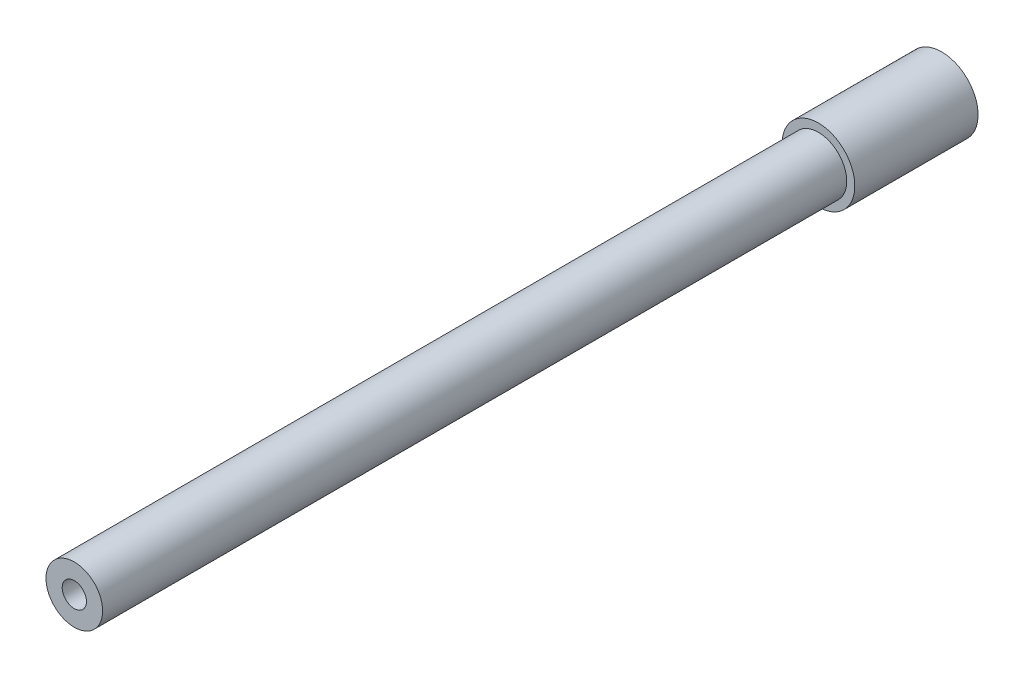
ISO-10303-21;
HEADER;
FILE_DESCRIPTION(('STEP AP214'),'2;1');
FILE_NAME('part.step','',(''),(''),'','','');
FILE_SCHEMA(('AUTOMOTIVE_DESIGN { 1 0 10303 214 1 1 1 1 }'));
ENDSEC;
DATA;
#1=APPLICATION_CONTEXT('core data for automotive mechanical design processes');
#2=APPLICATION_PROTOCOL_DEFINITION('international standard','automotive_design',2000,#1);
#3=PRODUCT_CONTEXT('',#1,'mechanical');
#4=PRODUCT('Part','Part','',(#3));
#5=PRODUCT_RELATED_PRODUCT_CATEGORY('part','',(#4));
#6=PRODUCT_DEFINITION_FORMATION('','',#4);
#7=PRODUCT_DEFINITION_CONTEXT('part definition',#1,'design');
#8=PRODUCT_DEFINITION('design','',#6,#7);
#9=PRODUCT_DEFINITION_SHAPE('','',#8);
#10=(LENGTH_UNIT() NAMED_UNIT(*) SI_UNIT(.MILLI.,.METRE.));
#11=(NAMED_UNIT(*) PLANE_ANGLE_UNIT() SI_UNIT($,.RADIAN.));
#12=(NAMED_UNIT(*) SI_UNIT($,.STERADIAN.) SOLID_ANGLE_UNIT());
#13=UNCERTAINTY_MEASURE_WITH_UNIT(LENGTH_MEASURE(1.E-05),#10,'distance_accuracy_value','');
#14=(GEOMETRIC_REPRESENTATION_CONTEXT(3) GLOBAL_UNCERTAINTY_ASSIGNED_CONTEXT((#13)) GLOBAL_UNIT_ASSIGNED_CONTEXT((#10,
#11,#12)) REPRESENTATION_CONTEXT('',''));
#15=CARTESIAN_POINT('',(0.,0.,0.));
#16=DIRECTION('',(0.,0.,1.));
#17=DIRECTION('',(1.,0.,0.));
#18=AXIS2_PLACEMENT_3D('',#15,#16,#17);
#19=CARTESIAN_POINT('',(5.82639397322076,0.,53.62));
#20=DIRECTION('',(0.,0.,-1.));
#21=DIRECTION('',(-1.,0.,0.));
#22=AXIS2_PLACEMENT_3D('',#19,#20,#21);
#23=CYLINDRICAL_SURFACE('',#22,1.75);
#24=CARTESIAN_POINT('',(5.82639397322076,0.,53.62));
#25=DIRECTION('',(0.,0.,1.));
#26=DIRECTION('',(1.,0.,0.));
#27=AXIS2_PLACEMENT_3D('',#24,#25,#26);
#28=CIRCLE('',#27,1.75);
#29=CARTESIAN_POINT('',(7.57639397322076,0.,53.62));
#30=VERTEX_POINT('',#29);
#31=EDGE_CURVE('E37',#30,#30,#28,.T.);
#32=ORIENTED_EDGE('',*,*,#31,.F.);
#33=EDGE_LOOP('',(#32));
#34=FACE_BOUND('',#33,.T.);
#35=CARTESIAN_POINT('',(5.82639397322076,0.,7.62));
#36=DIRECTION('',(0.,0.,-1.));
#37=DIRECTION('',(-1.,0.,0.));
#38=AXIS2_PLACEMENT_3D('',#35,#36,#37);
#39=CIRCLE('',#38,1.75);
#40=CARTESIAN_POINT('',(4.07639397322076,0.,7.62));
#41=VERTEX_POINT('',#40);
#42=EDGE_CURVE('E10',#41,#41,#39,.T.);
#43=ORIENTED_EDGE('',*,*,#42,.F.);
#44=EDGE_LOOP('',(#43));
#45=FACE_BOUND('',#44,.T.);
#46=ADVANCED_FACE('F31',(#34,#45),#23,.T.);
#47=CARTESIAN_POINT('',(5.82639397322076,0.,53.62));
#48=DIRECTION('',(0.,0.,1.));
#49=DIRECTION('',(1.,0.,0.));
#50=AXIS2_PLACEMENT_3D('',#47,#48,#49);
#51=PLANE('',#50);
#52=CARTESIAN_POINT('',(5.82639397322076,0.,53.62));
#53=DIRECTION('',(0.,0.,1.));
#54=DIRECTION('',(1.,0.,0.));
#55=AXIS2_PLACEMENT_3D('',#52,#53,#54);
#56=CIRCLE('',#55,0.749999999999998);
#57=CARTESIAN_POINT('',(6.57639397322076,0.,53.62));
#58=VERTEX_POINT('',#57);
#59=EDGE_CURVE('E45',#58,#58,#56,.T.);
#60=ORIENTED_EDGE('',*,*,#59,.F.);
#61=EDGE_LOOP('',(#60));
#62=FACE_BOUND('',#61,.T.);
#63=ORIENTED_EDGE('',*,*,#31,.T.);
#64=EDGE_LOOP('',(#63));
#65=FACE_BOUND('',#64,.T.);
#66=ADVANCED_FACE('F74',(#62,#65),#51,.T.);
#67=CARTESIAN_POINT('',(5.82639397322076,0.,43.62));
#68=DIRECTION('',(0.,0.,1.));
#69=DIRECTION('',(1.,0.,0.));
#70=AXIS2_PLACEMENT_3D('',#67,#68,#69);
#71=CYLINDRICAL_SURFACE('',#70,0.749999999999998);
#72=CARTESIAN_POINT('',(5.82639397322076,0.,43.62));
#73=DIRECTION('',(0.,0.,1.));
#74=DIRECTION('',(1.,0.,0.));
#75=AXIS2_PLACEMENT_3D('',#72,#73,#74);
#76=CIRCLE('',#75,0.749999999999998);
#77=CARTESIAN_POINT('',(6.57639397322076,0.,43.62));
#78=VERTEX_POINT('',#77);
#79=EDGE_CURVE('E41',#78,#78,#76,.T.);
#80=ORIENTED_EDGE('',*,*,#79,.F.);
#81=EDGE_LOOP('',(#80));
#82=FACE_BOUND('',#81,.T.);
#83=ORIENTED_EDGE('',*,*,#59,.T.);
#84=EDGE_LOOP('',(#83));
#85=FACE_BOUND('',#84,.T.);
#86=ADVANCED_FACE('F70',(#82,#85),#71,.F.);
#87=CARTESIAN_POINT('',(5.82639397322076,0.,43.62));
#88=DIRECTION('',(0.,0.,1.));
#89=DIRECTION('',(1.,0.,0.));
#90=AXIS2_PLACEMENT_3D('',#87,#88,#89);
#91=PLANE('',#90);
#92=ORIENTED_EDGE('',*,*,#79,.T.);
#93=EDGE_LOOP('',(#92));
#94=FACE_BOUND('',#93,.T.);
#95=ADVANCED_FACE('F62',(#94),#91,.T.);
#96=CARTESIAN_POINT('',(5.82639397322076,0.,7.62));
#97=DIRECTION('',(0.,0.,-1.));
#98=DIRECTION('',(-1.,0.,0.));
#99=AXIS2_PLACEMENT_3D('',#96,#97,#98);
#100=PLANE('',#99);
#101=CARTESIAN_POINT('',(5.82639397322076,0.,7.62));
#102=DIRECTION('',(0.,0.,-1.));
#103=DIRECTION('',(-1.,0.,0.));
#104=AXIS2_PLACEMENT_3D('',#101,#102,#103);
#105=CIRCLE('',#104,2.25);
#106=CARTESIAN_POINT('',(3.57639397322076,0.,7.62));
#107=VERTEX_POINT('',#106);
#108=EDGE_CURVE('E49',#107,#107,#105,.T.);
#109=ORIENTED_EDGE('',*,*,#108,.F.);
#110=EDGE_LOOP('',(#109));
#111=FACE_BOUND('',#110,.T.);
#112=ORIENTED_EDGE('',*,*,#42,.T.);
#113=EDGE_LOOP('',(#112));
#114=FACE_BOUND('',#113,.T.);
#115=ADVANCED_FACE('F60',(#111,#114),#100,.F.);
#116=CARTESIAN_POINT('',(5.82639397322076,0.,7.62));
#117=DIRECTION('',(0.,0.,-1.));
#118=DIRECTION('',(-1.,0.,0.));
#119=AXIS2_PLACEMENT_3D('',#116,#117,#118);
#120=CYLINDRICAL_SURFACE('',#119,2.25);
#121=CARTESIAN_POINT('',(5.82639397322076,0.,0.));
#122=DIRECTION('',(0.,0.,-1.));
#123=DIRECTION('',(-1.,0.,0.));
#124=AXIS2_PLACEMENT_3D('',#121,#122,#123);
#125=CIRCLE('',#124,2.25);
#126=CARTESIAN_POINT('',(3.57639397322076,0.,0.));
#127=VERTEX_POINT('',#126);
#128=EDGE_CURVE('E51',#127,#127,#125,.T.);
#129=CARTESIAN_POINT('',(3.57639397322076,0.,7.62));
#130=CARTESIAN_POINT('',(3.57639397322076,0.,7.540625));
#131=CARTESIAN_POINT('',(3.57639397322076,0.,7.46125));
#132=CARTESIAN_POINT('',(3.57639397322076,0.,7.3025));
#133=CARTESIAN_POINT('',(3.57639397322076,0.,7.223125));
#134=CARTESIAN_POINT('',(3.57639397322076,0.,7.064375));
#135=CARTESIAN_POINT('',(3.57639397322076,0.,6.985));
#136=CARTESIAN_POINT('',(3.57639397322076,0.,6.82625));
#137=CARTESIAN_POINT('',(3.57639397322076,0.,6.746875));
#138=CARTESIAN_POINT('',(3.57639397322076,0.,6.588125));
#139=CARTESIAN_POINT('',(3.57639397322076,0.,6.50875));
#140=CARTESIAN_POINT('',(3.57639397322076,0.,6.35));
#141=CARTESIAN_POINT('',(3.57639397322076,0.,6.270625));
#142=CARTESIAN_POINT('',(3.57639397322076,0.,6.111875));
#143=CARTESIAN_POINT('',(3.57639397322076,0.,6.0325));
#144=CARTESIAN_POINT('',(3.57639397322076,0.,5.87375));
#145=CARTESIAN_POINT('',(3.57639397322076,0.,5.794375));
#146=CARTESIAN_POINT('',(3.57639397322076,0.,5.635625));
#147=CARTESIAN_POINT('',(3.57639397322076,0.,5.55625));
#148=CARTESIAN_POINT('',(3.57639397322076,0.,5.3975));
#149=CARTESIAN_POINT('',(3.57639397322076,0.,5.318125));
#150=CARTESIAN_POINT('',(3.57639397322076,0.,5.159375));
#151=CARTESIAN_POINT('',(3.57639397322076,0.,5.08));
#152=CARTESIAN_POINT('',(3.57639397322076,0.,4.92125));
#153=CARTESIAN_POINT('',(3.57639397322076,0.,4.841875));
#154=CARTESIAN_POINT('',(3.57639397322076,0.,4.683125));
#155=CARTESIAN_POINT('',(3.57639397322076,0.,4.60375));
#156=CARTESIAN_POINT('',(3.57639397322076,0.,4.445));
#157=CARTESIAN_POINT('',(3.57639397322076,0.,4.365625));
#158=CARTESIAN_POINT('',(3.57639397322076,0.,4.206875));
#159=CARTESIAN_POINT('',(3.57639397322076,0.,4.1275));
#160=CARTESIAN_POINT('',(3.57639397322076,0.,3.96875));
#161=CARTESIAN_POINT('',(3.57639397322076,0.,3.889375));
#162=CARTESIAN_POINT('',(3.57639397322076,0.,3.730625));
#163=CARTESIAN_POINT('',(3.57639397322076,0.,3.65125));
#164=CARTESIAN_POINT('',(3.57639397322076,0.,3.4925));
#165=CARTESIAN_POINT('',(3.57639397322076,0.,3.413125));
#166=CARTESIAN_POINT('',(3.57639397322076,0.,3.254375));
#167=CARTESIAN_POINT('',(3.57639397322076,0.,3.175));
#168=CARTESIAN_POINT('',(3.57639397322076,0.,3.01625));
#169=CARTESIAN_POINT('',(3.57639397322076,0.,2.936875));
#170=CARTESIAN_POINT('',(3.57639397322076,0.,2.778125));
#171=CARTESIAN_POINT('',(3.57639397322076,0.,2.69875));
#172=CARTESIAN_POINT('',(3.57639397322076,0.,2.54));
#173=CARTESIAN_POINT('',(3.57639397322076,0.,2.460625));
#174=CARTESIAN_POINT('',(3.57639397322076,0.,2.301875));
#175=CARTESIAN_POINT('',(3.57639397322076,0.,2.2225));
#176=CARTESIAN_POINT('',(3.57639397322076,0.,2.06375));
#177=CARTESIAN_POINT('',(3.57639397322076,0.,1.984375));
#178=CARTESIAN_POINT('',(3.57639397322076,0.,1.825625));
#179=CARTESIAN_POINT('',(3.57639397322076,0.,1.74625));
#180=CARTESIAN_POINT('',(3.57639397322076,0.,1.5875));
#181=CARTESIAN_POINT('',(3.57639397322076,0.,1.508125));
#182=CARTESIAN_POINT('',(3.57639397322076,0.,1.349375));
#183=CARTESIAN_POINT('',(3.57639397322076,0.,1.27));
#184=CARTESIAN_POINT('',(3.57639397322076,0.,1.11125));
#185=CARTESIAN_POINT('',(3.57639397322076,0.,1.031875));
#186=CARTESIAN_POINT('',(3.57639397322076,0.,0.873125));
#187=CARTESIAN_POINT('',(3.57639397322076,0.,0.79375));
#188=CARTESIAN_POINT('',(3.57639397322076,0.,0.635));
#189=CARTESIAN_POINT('',(3.57639397322076,0.,0.555625));
#190=CARTESIAN_POINT('',(3.57639397322076,0.,0.396875));
#191=CARTESIAN_POINT('',(3.57639397322076,0.,0.3175));
#192=CARTESIAN_POINT('',(3.57639397322076,0.,0.15875));
#193=CARTESIAN_POINT('',(3.57639397322076,0.,0.0793749999999999));
#194=CARTESIAN_POINT('',(3.57639397322076,0.,0.));
#195=B_SPLINE_CURVE_WITH_KNOTS('',3,(#129,#130,#131,#132,#133,#134,#135,#136,#137,#138,#139,
#140,#141,#142,#143,#144,#145,#146,#147,#148,#149,#150,#151,#152,#153,#154,#155,#156,#157,#158,
#159,#160,#161,#162,#163,#164,#165,#166,#167,#168,#169,#170,#171,#172,#173,#174,#175,#176,#177,
#178,#179,#180,#181,#182,#183,#184,#185,#186,#187,#188,#189,#190,#191,#192,#193,#194),
.UNSPECIFIED.,.F.,.F.,(4,2,2,2,2,2,2,2,2,2,2,2,2,2,2,2,2,2,2,2,2,2,2,2,2,2,2,2,2,2,2,2,4),(0.,
0.238125,0.47625,0.714375000000001,0.9525,1.190625,1.42875,1.666875,1.905,2.143125,2.38125,
2.619375,2.8575,3.095625,3.33375,3.571875,3.81,4.048125,4.28625,4.524375,4.7625,5.000625,
5.23875,5.476875,5.715,5.953125,6.19125,6.429375,6.6675,6.905625,7.14375,7.381875,7.62),.UNSPECIFIED.);
#196=EDGE_CURVE('BSEAM57',#107,#127,#195,.T.);
#197=ORIENTED_EDGE('',*,*,#108,.T.);
#198=ORIENTED_EDGE('',*,*,#128,.F.);
#199=ORIENTED_EDGE('',*,*,#196,.T.);
#200=ORIENTED_EDGE('',*,*,#196,.F.);
#201=EDGE_LOOP('',(#197,#199,#198,#200));
#202=FACE_BOUND('',#201,.T.);
#203=ADVANCED_FACE('F57',(#202),#120,.T.);
#204=CARTESIAN_POINT('',(5.82639397322076,0.,0.));
#205=DIRECTION('',(0.,0.,1.));
#206=DIRECTION('',(1.,0.,0.));
#207=AXIS2_PLACEMENT_3D('',#204,#205,#206);
#208=PLANE('',#207);
#209=ORIENTED_EDGE('',*,*,#128,.T.);
#210=EDGE_LOOP('',(#209));
#211=FACE_BOUND('',#210,.T.);
#212=ADVANCED_FACE('F68',(#211),#208,.F.);
#213=CLOSED_SHELL('',(#46,#66,#86,#95,#115,#203,#212));
#214=MANIFOLD_SOLID_BREP('B2',#213);
#215=ADVANCED_BREP_SHAPE_REPRESENTATION('',(#18,#214),#14);
#216=SHAPE_DEFINITION_REPRESENTATION(#9,#215);
ENDSEC;
END-ISO-10303-21;
